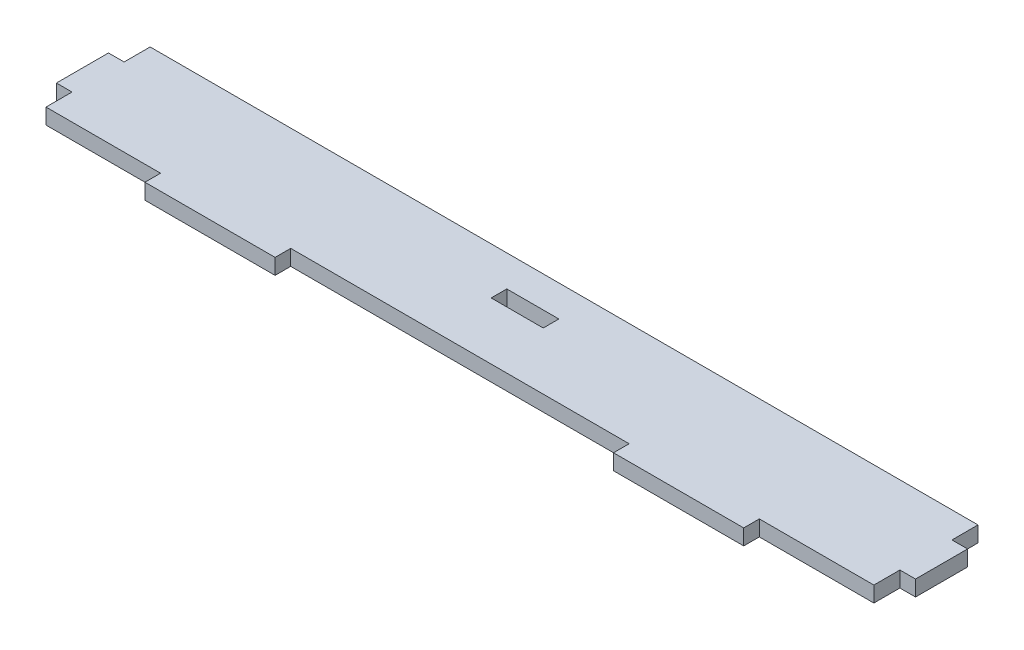
ISO-10303-21;
HEADER;
FILE_DESCRIPTION(('STEP AP214'),'2;1');
FILE_NAME('part.step','',(''),(''),'','','');
FILE_SCHEMA(('AUTOMOTIVE_DESIGN { 1 0 10303 214 1 1 1 1 }'));
ENDSEC;
DATA;
#1=APPLICATION_CONTEXT('core data for automotive mechanical design processes');
#2=APPLICATION_PROTOCOL_DEFINITION('international standard','automotive_design',2000,#1);
#3=PRODUCT_CONTEXT('',#1,'mechanical');
#4=PRODUCT('Part','Part','',(#3));
#5=PRODUCT_RELATED_PRODUCT_CATEGORY('part','',(#4));
#6=PRODUCT_DEFINITION_FORMATION('','',#4);
#7=PRODUCT_DEFINITION_CONTEXT('part definition',#1,'design');
#8=PRODUCT_DEFINITION('design','',#6,#7);
#9=PRODUCT_DEFINITION_SHAPE('','',#8);
#10=(LENGTH_UNIT() NAMED_UNIT(*) SI_UNIT(.MILLI.,.METRE.));
#11=(NAMED_UNIT(*) PLANE_ANGLE_UNIT() SI_UNIT($,.RADIAN.));
#12=(NAMED_UNIT(*) SI_UNIT($,.STERADIAN.) SOLID_ANGLE_UNIT());
#13=UNCERTAINTY_MEASURE_WITH_UNIT(LENGTH_MEASURE(1.E-05),#10,'distance_accuracy_value','');
#14=(GEOMETRIC_REPRESENTATION_CONTEXT(3) GLOBAL_UNCERTAINTY_ASSIGNED_CONTEXT((#13)) GLOBAL_UNIT_ASSIGNED_CONTEXT((#10,
#11,#12)) REPRESENTATION_CONTEXT('',''));
#15=CARTESIAN_POINT('',(0.,0.,0.));
#16=DIRECTION('',(0.,0.,1.));
#17=DIRECTION('',(1.,0.,0.));
#18=AXIS2_PLACEMENT_3D('',#15,#16,#17);
#19=CARTESIAN_POINT('',(0.,3.,0.));
#20=DIRECTION('',(0.,-1.,0.));
#21=DIRECTION('',(0.,0.,-1.));
#22=AXIS2_PLACEMENT_3D('',#19,#20,#21);
#23=PLANE('',#22);
#24=DIRECTION('',(-1.,0.,0.));
#25=VECTOR('',#24,1.);
#26=CARTESIAN_POINT('',(79.5,3.,-10.));
#27=LINE('',#26,#25);
#28=CARTESIAN_POINT('',(79.5,3.,-10.));
#29=VERTEX_POINT('',#28);
#30=CARTESIAN_POINT('',(-79.5,3.,-9.99999999999999));
#31=VERTEX_POINT('',#30);
#32=EDGE_CURVE('E230',#29,#31,#27,.T.);
#33=ORIENTED_EDGE('',*,*,#32,.T.);
#34=DIRECTION('',(0.,0.,1.));
#35=VECTOR('',#34,1.);
#36=CARTESIAN_POINT('',(-79.5,3.,-4.99999999999999));
#37=LINE('',#36,#35);
#38=CARTESIAN_POINT('',(-79.5,3.,-4.99999999999999));
#39=VERTEX_POINT('',#38);
#40=EDGE_CURVE('E233',#31,#39,#37,.T.);
#41=ORIENTED_EDGE('',*,*,#40,.T.);
#42=DIRECTION('',(-1.,0.,0.));
#43=VECTOR('',#42,1.);
#44=CARTESIAN_POINT('',(-79.5,3.,-4.99999999999999));
#45=LINE('',#44,#43);
#46=CARTESIAN_POINT('',(-82.5,3.,-4.99999999999999));
#47=VERTEX_POINT('',#46);
#48=EDGE_CURVE('E236',#39,#47,#45,.T.);
#49=ORIENTED_EDGE('',*,*,#48,.T.);
#50=DIRECTION('',(0.,0.,1.));
#51=VECTOR('',#50,1.);
#52=CARTESIAN_POINT('',(-82.5,3.,-4.99999999999999));
#53=LINE('',#52,#51);
#54=CARTESIAN_POINT('',(-82.5,3.,5.00000000000001));
#55=VERTEX_POINT('',#54);
#56=EDGE_CURVE('E238',#47,#55,#53,.T.);
#57=ORIENTED_EDGE('',*,*,#56,.T.);
#58=DIRECTION('',(1.,0.,0.));
#59=VECTOR('',#58,1.);
#60=CARTESIAN_POINT('',(-79.5,3.,5.00000000000001));
#61=LINE('',#60,#59);
#62=CARTESIAN_POINT('',(-79.5,3.,5.00000000000001));
#63=VERTEX_POINT('',#62);
#64=EDGE_CURVE('E240',#55,#63,#61,.T.);
#65=ORIENTED_EDGE('',*,*,#64,.T.);
#66=DIRECTION('',(0.,0.,1.));
#67=VECTOR('',#66,1.);
#68=CARTESIAN_POINT('',(-79.5,3.,10.));
#69=LINE('',#68,#67);
#70=CARTESIAN_POINT('',(-79.5,3.,10.));
#71=VERTEX_POINT('',#70);
#72=EDGE_CURVE('E242',#63,#71,#69,.T.);
#73=ORIENTED_EDGE('',*,*,#72,.T.);
#74=DIRECTION('',(1.,0.,0.));
#75=VECTOR('',#74,1.);
#76=CARTESIAN_POINT('',(-57.5,3.,10.));
#77=LINE('',#76,#75);
#78=CARTESIAN_POINT('',(-57.5,3.,10.));
#79=VERTEX_POINT('',#78);
#80=EDGE_CURVE('E244',#71,#79,#77,.T.);
#81=ORIENTED_EDGE('',*,*,#80,.T.);
#82=DIRECTION('',(0.,0.,1.));
#83=VECTOR('',#82,1.);
#84=CARTESIAN_POINT('',(-57.5,3.,10.));
#85=LINE('',#84,#83);
#86=CARTESIAN_POINT('',(-57.5,3.,13.));
#87=VERTEX_POINT('',#86);
#88=EDGE_CURVE('E246',#79,#87,#85,.T.);
#89=ORIENTED_EDGE('',*,*,#88,.T.);
#90=DIRECTION('',(1.,0.,0.));
#91=VECTOR('',#90,1.);
#92=CARTESIAN_POINT('',(-57.5,3.,13.));
#93=LINE('',#92,#91);
#94=CARTESIAN_POINT('',(-32.5,3.,13.));
#95=VERTEX_POINT('',#94);
#96=EDGE_CURVE('E248',#87,#95,#93,.T.);
#97=ORIENTED_EDGE('',*,*,#96,.T.);
#98=DIRECTION('',(0.,0.,-1.));
#99=VECTOR('',#98,1.);
#100=CARTESIAN_POINT('',(-32.5,3.,10.));
#101=LINE('',#100,#99);
#102=CARTESIAN_POINT('',(-32.5,3.,10.));
#103=VERTEX_POINT('',#102);
#104=EDGE_CURVE('E250',#95,#103,#101,.T.);
#105=ORIENTED_EDGE('',*,*,#104,.T.);
#106=DIRECTION('',(1.,0.,0.));
#107=VECTOR('',#106,1.);
#108=CARTESIAN_POINT('',(32.5,3.,10.));
#109=LINE('',#108,#107);
#110=CARTESIAN_POINT('',(32.5,3.,10.));
#111=VERTEX_POINT('',#110);
#112=EDGE_CURVE('E252',#103,#111,#109,.T.);
#113=ORIENTED_EDGE('',*,*,#112,.T.);
#114=DIRECTION('',(0.,0.,1.));
#115=VECTOR('',#114,1.);
#116=CARTESIAN_POINT('',(32.5,3.,10.));
#117=LINE('',#116,#115);
#118=CARTESIAN_POINT('',(32.5,3.,13.));
#119=VERTEX_POINT('',#118);
#120=EDGE_CURVE('E254',#111,#119,#117,.T.);
#121=ORIENTED_EDGE('',*,*,#120,.T.);
#122=DIRECTION('',(1.,0.,0.));
#123=VECTOR('',#122,1.);
#124=CARTESIAN_POINT('',(32.5,3.,13.));
#125=LINE('',#124,#123);
#126=CARTESIAN_POINT('',(57.5,3.,13.));
#127=VERTEX_POINT('',#126);
#128=EDGE_CURVE('E256',#119,#127,#125,.T.);
#129=ORIENTED_EDGE('',*,*,#128,.T.);
#130=DIRECTION('',(0.,0.,-1.));
#131=VECTOR('',#130,1.);
#132=CARTESIAN_POINT('',(57.5,3.,9.99999999999999));
#133=LINE('',#132,#131);
#134=CARTESIAN_POINT('',(57.5,3.,9.99999999999999));
#135=VERTEX_POINT('',#134);
#136=EDGE_CURVE('E258',#127,#135,#133,.T.);
#137=ORIENTED_EDGE('',*,*,#136,.T.);
#138=DIRECTION('',(1.,0.,0.));
#139=VECTOR('',#138,1.);
#140=CARTESIAN_POINT('',(79.5,3.,9.99999999999999));
#141=LINE('',#140,#139);
#142=CARTESIAN_POINT('',(79.5,3.,9.99999999999999));
#143=VERTEX_POINT('',#142);
#144=EDGE_CURVE('E260',#135,#143,#141,.T.);
#145=ORIENTED_EDGE('',*,*,#144,.T.);
#146=DIRECTION('',(0.,0.,-1.));
#147=VECTOR('',#146,1.);
#148=CARTESIAN_POINT('',(79.5,3.,9.99999999999999));
#149=LINE('',#148,#147);
#150=CARTESIAN_POINT('',(79.5,3.,5.00000000000001));
#151=VERTEX_POINT('',#150);
#152=EDGE_CURVE('E262',#143,#151,#149,.T.);
#153=ORIENTED_EDGE('',*,*,#152,.T.);
#154=DIRECTION('',(1.,0.,0.));
#155=VECTOR('',#154,1.);
#156=CARTESIAN_POINT('',(79.5,3.,5.00000000000001));
#157=LINE('',#156,#155);
#158=CARTESIAN_POINT('',(82.5,3.,5.00000000000001));
#159=VERTEX_POINT('',#158);
#160=EDGE_CURVE('E264',#151,#159,#157,.T.);
#161=ORIENTED_EDGE('',*,*,#160,.T.);
#162=DIRECTION('',(0.,0.,-1.));
#163=VECTOR('',#162,1.);
#164=CARTESIAN_POINT('',(82.5,3.,-4.99999999999999));
#165=LINE('',#164,#163);
#166=CARTESIAN_POINT('',(82.5,3.,-4.99999999999999));
#167=VERTEX_POINT('',#166);
#168=EDGE_CURVE('E266',#159,#167,#165,.T.);
#169=ORIENTED_EDGE('',*,*,#168,.T.);
#170=DIRECTION('',(-1.,0.,0.));
#171=VECTOR('',#170,1.);
#172=CARTESIAN_POINT('',(79.5,3.,-4.99999999999999));
#173=LINE('',#172,#171);
#174=CARTESIAN_POINT('',(79.5,3.,-4.99999999999999));
#175=VERTEX_POINT('',#174);
#176=EDGE_CURVE('E268',#167,#175,#173,.T.);
#177=ORIENTED_EDGE('',*,*,#176,.T.);
#178=DIRECTION('',(0.,0.,-1.));
#179=VECTOR('',#178,1.);
#180=CARTESIAN_POINT('',(79.5,3.,-4.99999999999999));
#181=LINE('',#180,#179);
#182=EDGE_CURVE('E270',#175,#29,#181,.T.);
#183=ORIENTED_EDGE('',*,*,#182,.T.);
#184=EDGE_LOOP('',(#33,#41,#49,#57,#65,#73,#81,#89,#97,#105,#113,#121,#129,#137,#145,#153,#161,
#169,#177,#183));
#185=FACE_BOUND('',#184,.T.);
#186=DIRECTION('',(0.,0.,-1.));
#187=VECTOR('',#186,1.);
#188=CARTESIAN_POINT('',(5.,3.,-4.));
#189=LINE('',#188,#187);
#190=CARTESIAN_POINT('',(5.,3.,-0.999999999999999));
#191=VERTEX_POINT('',#190);
#192=CARTESIAN_POINT('',(5.,3.,-4.));
#193=VERTEX_POINT('',#192);
#194=EDGE_CURVE('E194',#191,#193,#189,.T.);
#195=ORIENTED_EDGE('',*,*,#194,.F.);
#196=DIRECTION('',(1.,0.,0.));
#197=VECTOR('',#196,1.);
#198=CARTESIAN_POINT('',(-5.,3.,-0.999999999999999));
#199=LINE('',#198,#197);
#200=CARTESIAN_POINT('',(-5.,3.,-0.999999999999999));
#201=VERTEX_POINT('',#200);
#202=EDGE_CURVE('E216',#201,#191,#199,.T.);
#203=ORIENTED_EDGE('',*,*,#202,.F.);
#204=DIRECTION('',(0.,0.,1.));
#205=VECTOR('',#204,1.);
#206=CARTESIAN_POINT('',(-5.,3.,-4.));
#207=LINE('',#206,#205);
#208=CARTESIAN_POINT('',(-5.,3.,-4.));
#209=VERTEX_POINT('',#208);
#210=EDGE_CURVE('E214',#209,#201,#207,.T.);
#211=ORIENTED_EDGE('',*,*,#210,.F.);
#212=DIRECTION('',(-1.,0.,0.));
#213=VECTOR('',#212,1.);
#214=CARTESIAN_POINT('',(-5.,3.,-4.));
#215=LINE('',#214,#213);
#216=EDGE_CURVE('E202',#193,#209,#215,.T.);
#217=ORIENTED_EDGE('',*,*,#216,.F.);
#218=EDGE_LOOP('',(#195,#203,#211,#217));
#219=FACE_BOUND('',#218,.T.);
#220=ADVANCED_FACE('F33',(#185,#219),#23,.F.);
#221=CARTESIAN_POINT('',(0.,0.,0.));
#222=DIRECTION('',(0.,-1.,0.));
#223=DIRECTION('',(0.,0.,-1.));
#224=AXIS2_PLACEMENT_3D('',#221,#222,#223);
#225=PLANE('',#224);
#226=DIRECTION('',(-1.,0.,0.));
#227=VECTOR('',#226,1.);
#228=CARTESIAN_POINT('',(79.5,0.,-10.));
#229=LINE('',#228,#227);
#230=CARTESIAN_POINT('',(79.5,0.,-10.));
#231=VERTEX_POINT('',#230);
#232=CARTESIAN_POINT('',(-79.5,0.,-9.99999999999999));
#233=VERTEX_POINT('',#232);
#234=EDGE_CURVE('E210',#231,#233,#229,.T.);
#235=ORIENTED_EDGE('',*,*,#234,.F.);
#236=DIRECTION('',(0.,0.,-1.));
#237=VECTOR('',#236,1.);
#238=CARTESIAN_POINT('',(79.5,0.,-4.99999999999999));
#239=LINE('',#238,#237);
#240=CARTESIAN_POINT('',(79.5,0.,-4.99999999999999));
#241=VERTEX_POINT('',#240);
#242=EDGE_CURVE('E234',#241,#231,#239,.T.);
#243=ORIENTED_EDGE('',*,*,#242,.F.);
#244=DIRECTION('',(-1.,0.,0.));
#245=VECTOR('',#244,1.);
#246=CARTESIAN_POINT('',(79.5,0.,-4.99999999999999));
#247=LINE('',#246,#245);
#248=CARTESIAN_POINT('',(82.5,0.,-4.99999999999999));
#249=VERTEX_POINT('',#248);
#250=EDGE_CURVE('E309',#249,#241,#247,.T.);
#251=ORIENTED_EDGE('',*,*,#250,.F.);
#252=DIRECTION('',(0.,0.,-1.));
#253=VECTOR('',#252,1.);
#254=CARTESIAN_POINT('',(82.5,0.,-4.99999999999999));
#255=LINE('',#254,#253);
#256=CARTESIAN_POINT('',(82.5,0.,5.00000000000001));
#257=VERTEX_POINT('',#256);
#258=EDGE_CURVE('E307',#257,#249,#255,.T.);
#259=ORIENTED_EDGE('',*,*,#258,.F.);
#260=DIRECTION('',(1.,0.,0.));
#261=VECTOR('',#260,1.);
#262=CARTESIAN_POINT('',(79.5,0.,5.00000000000001));
#263=LINE('',#262,#261);
#264=CARTESIAN_POINT('',(79.5,0.,5.00000000000001));
#265=VERTEX_POINT('',#264);
#266=EDGE_CURVE('E305',#265,#257,#263,.T.);
#267=ORIENTED_EDGE('',*,*,#266,.F.);
#268=DIRECTION('',(0.,0.,-1.));
#269=VECTOR('',#268,1.);
#270=CARTESIAN_POINT('',(79.5,0.,9.99999999999999));
#271=LINE('',#270,#269);
#272=CARTESIAN_POINT('',(79.5,0.,9.99999999999999));
#273=VERTEX_POINT('',#272);
#274=EDGE_CURVE('E303',#273,#265,#271,.T.);
#275=ORIENTED_EDGE('',*,*,#274,.F.);
#276=DIRECTION('',(1.,0.,0.));
#277=VECTOR('',#276,1.);
#278=CARTESIAN_POINT('',(79.5,0.,9.99999999999999));
#279=LINE('',#278,#277);
#280=CARTESIAN_POINT('',(57.5,0.,9.99999999999999));
#281=VERTEX_POINT('',#280);
#282=EDGE_CURVE('E301',#281,#273,#279,.T.);
#283=ORIENTED_EDGE('',*,*,#282,.F.);
#284=DIRECTION('',(0.,0.,-1.));
#285=VECTOR('',#284,1.);
#286=CARTESIAN_POINT('',(57.5,0.,9.99999999999999));
#287=LINE('',#286,#285);
#288=CARTESIAN_POINT('',(57.5,0.,13.));
#289=VERTEX_POINT('',#288);
#290=EDGE_CURVE('E299',#289,#281,#287,.T.);
#291=ORIENTED_EDGE('',*,*,#290,.F.);
#292=DIRECTION('',(1.,0.,0.));
#293=VECTOR('',#292,1.);
#294=CARTESIAN_POINT('',(32.5,0.,13.));
#295=LINE('',#294,#293);
#296=CARTESIAN_POINT('',(32.5,0.,13.));
#297=VERTEX_POINT('',#296);
#298=EDGE_CURVE('E297',#297,#289,#295,.T.);
#299=ORIENTED_EDGE('',*,*,#298,.F.);
#300=DIRECTION('',(0.,0.,1.));
#301=VECTOR('',#300,1.);
#302=CARTESIAN_POINT('',(32.5,0.,10.));
#303=LINE('',#302,#301);
#304=CARTESIAN_POINT('',(32.5,0.,10.));
#305=VERTEX_POINT('',#304);
#306=EDGE_CURVE('E295',#305,#297,#303,.T.);
#307=ORIENTED_EDGE('',*,*,#306,.F.);
#308=DIRECTION('',(1.,0.,0.));
#309=VECTOR('',#308,1.);
#310=CARTESIAN_POINT('',(32.5,0.,10.));
#311=LINE('',#310,#309);
#312=CARTESIAN_POINT('',(-32.5,0.,10.));
#313=VERTEX_POINT('',#312);
#314=EDGE_CURVE('E293',#313,#305,#311,.T.);
#315=ORIENTED_EDGE('',*,*,#314,.F.);
#316=DIRECTION('',(0.,0.,-1.));
#317=VECTOR('',#316,1.);
#318=CARTESIAN_POINT('',(-32.5,0.,10.));
#319=LINE('',#318,#317);
#320=CARTESIAN_POINT('',(-32.5,0.,13.));
#321=VERTEX_POINT('',#320);
#322=EDGE_CURVE('E291',#321,#313,#319,.T.);
#323=ORIENTED_EDGE('',*,*,#322,.F.);
#324=DIRECTION('',(1.,0.,0.));
#325=VECTOR('',#324,1.);
#326=CARTESIAN_POINT('',(-57.5,0.,13.));
#327=LINE('',#326,#325);
#328=CARTESIAN_POINT('',(-57.5,0.,13.));
#329=VERTEX_POINT('',#328);
#330=EDGE_CURVE('E289',#329,#321,#327,.T.);
#331=ORIENTED_EDGE('',*,*,#330,.F.);
#332=DIRECTION('',(0.,0.,1.));
#333=VECTOR('',#332,1.);
#334=CARTESIAN_POINT('',(-57.5,0.,10.));
#335=LINE('',#334,#333);
#336=CARTESIAN_POINT('',(-57.5,0.,10.));
#337=VERTEX_POINT('',#336);
#338=EDGE_CURVE('E287',#337,#329,#335,.T.);
#339=ORIENTED_EDGE('',*,*,#338,.F.);
#340=DIRECTION('',(1.,0.,0.));
#341=VECTOR('',#340,1.);
#342=CARTESIAN_POINT('',(-57.5,0.,10.));
#343=LINE('',#342,#341);
#344=CARTESIAN_POINT('',(-79.5,0.,10.));
#345=VERTEX_POINT('',#344);
#346=EDGE_CURVE('E285',#345,#337,#343,.T.);
#347=ORIENTED_EDGE('',*,*,#346,.F.);
#348=DIRECTION('',(0.,0.,1.));
#349=VECTOR('',#348,1.);
#350=CARTESIAN_POINT('',(-79.5,0.,10.));
#351=LINE('',#350,#349);
#352=CARTESIAN_POINT('',(-79.5,0.,5.00000000000001));
#353=VERTEX_POINT('',#352);
#354=EDGE_CURVE('E283',#353,#345,#351,.T.);
#355=ORIENTED_EDGE('',*,*,#354,.F.);
#356=DIRECTION('',(1.,0.,0.));
#357=VECTOR('',#356,1.);
#358=CARTESIAN_POINT('',(-79.5,0.,5.00000000000001));
#359=LINE('',#358,#357);
#360=CARTESIAN_POINT('',(-82.5,0.,5.00000000000001));
#361=VERTEX_POINT('',#360);
#362=EDGE_CURVE('E281',#361,#353,#359,.T.);
#363=ORIENTED_EDGE('',*,*,#362,.F.);
#364=DIRECTION('',(0.,0.,1.));
#365=VECTOR('',#364,1.);
#366=CARTESIAN_POINT('',(-82.5,0.,-4.99999999999999));
#367=LINE('',#366,#365);
#368=CARTESIAN_POINT('',(-82.5,0.,-4.99999999999999));
#369=VERTEX_POINT('',#368);
#370=EDGE_CURVE('E279',#369,#361,#367,.T.);
#371=ORIENTED_EDGE('',*,*,#370,.F.);
#372=DIRECTION('',(-1.,0.,0.));
#373=VECTOR('',#372,1.);
#374=CARTESIAN_POINT('',(-79.5,0.,-4.99999999999999));
#375=LINE('',#374,#373);
#376=CARTESIAN_POINT('',(-79.5,0.,-4.99999999999999));
#377=VERTEX_POINT('',#376);
#378=EDGE_CURVE('E277',#377,#369,#375,.T.);
#379=ORIENTED_EDGE('',*,*,#378,.F.);
#380=DIRECTION('',(0.,0.,1.));
#381=VECTOR('',#380,1.);
#382=CARTESIAN_POINT('',(-79.5,0.,-4.99999999999999));
#383=LINE('',#382,#381);
#384=EDGE_CURVE('E275',#233,#377,#383,.T.);
#385=ORIENTED_EDGE('',*,*,#384,.F.);
#386=EDGE_LOOP('',(#235,#243,#251,#259,#267,#275,#283,#291,#299,#307,#315,#323,#331,#339,#347,
#355,#363,#371,#379,#385));
#387=FACE_BOUND('',#386,.T.);
#388=DIRECTION('',(1.,0.,0.));
#389=VECTOR('',#388,1.);
#390=CARTESIAN_POINT('',(-5.,0.,-0.999999999999999));
#391=LINE('',#390,#389);
#392=CARTESIAN_POINT('',(-5.,0.,-0.999999999999999));
#393=VERTEX_POINT('',#392);
#394=CARTESIAN_POINT('',(5.,0.,-0.999999999999999));
#395=VERTEX_POINT('',#394);
#396=EDGE_CURVE('E203',#393,#395,#391,.T.);
#397=ORIENTED_EDGE('',*,*,#396,.T.);
#398=DIRECTION('',(0.,0.,-1.));
#399=VECTOR('',#398,1.);
#400=CARTESIAN_POINT('',(5.,0.,-4.));
#401=LINE('',#400,#399);
#402=CARTESIAN_POINT('',(5.,0.,-4.));
#403=VERTEX_POINT('',#402);
#404=EDGE_CURVE('E56',#395,#403,#401,.T.);
#405=ORIENTED_EDGE('',*,*,#404,.T.);
#406=DIRECTION('',(-1.,0.,0.));
#407=VECTOR('',#406,1.);
#408=CARTESIAN_POINT('',(-5.,0.,-4.));
#409=LINE('',#408,#407);
#410=CARTESIAN_POINT('',(-5.,0.,-4.));
#411=VERTEX_POINT('',#410);
#412=EDGE_CURVE('E209',#403,#411,#409,.T.);
#413=ORIENTED_EDGE('',*,*,#412,.T.);
#414=DIRECTION('',(0.,0.,1.));
#415=VECTOR('',#414,1.);
#416=CARTESIAN_POINT('',(-5.,0.,-4.));
#417=LINE('',#416,#415);
#418=EDGE_CURVE('E222',#411,#393,#417,.T.);
#419=ORIENTED_EDGE('',*,*,#418,.T.);
#420=EDGE_LOOP('',(#397,#405,#413,#419));
#421=FACE_BOUND('',#420,.T.);
#422=ADVANCED_FACE('F375',(#387,#421),#225,.T.);
#423=CARTESIAN_POINT('',(79.5,3.,-10.));
#424=DIRECTION('',(0.,0.,1.));
#425=DIRECTION('',(1.,0.,0.));
#426=AXIS2_PLACEMENT_3D('',#423,#424,#425);
#427=PLANE('',#426);
#428=ORIENTED_EDGE('',*,*,#234,.T.);
#429=DIRECTION('',(0.,-1.,0.));
#430=VECTOR('',#429,1.);
#431=CARTESIAN_POINT('',(-79.5,3.,-9.99999999999999));
#432=LINE('',#431,#430);
#433=EDGE_CURVE('E11',#31,#233,#432,.T.);
#434=ORIENTED_EDGE('',*,*,#433,.F.);
#435=ORIENTED_EDGE('',*,*,#32,.F.);
#436=DIRECTION('',(0.,-1.,0.));
#437=VECTOR('',#436,1.);
#438=CARTESIAN_POINT('',(79.5,3.,-10.));
#439=LINE('',#438,#437);
#440=EDGE_CURVE('E272',#29,#231,#439,.T.);
#441=ORIENTED_EDGE('',*,*,#440,.T.);
#442=EDGE_LOOP('',(#428,#434,#435,#441));
#443=FACE_BOUND('',#442,.T.);
#444=ADVANCED_FACE('F35',(#443),#427,.F.);
#445=CARTESIAN_POINT('',(-79.5,3.,-4.99999999999999));
#446=DIRECTION('',(1.,0.,0.));
#447=DIRECTION('',(0.,0.,-1.));
#448=AXIS2_PLACEMENT_3D('',#445,#446,#447);
#449=PLANE('',#448);
#450=ORIENTED_EDGE('',*,*,#384,.T.);
#451=DIRECTION('',(0.,-1.,0.));
#452=VECTOR('',#451,1.);
#453=CARTESIAN_POINT('',(-79.5,3.,-4.99999999999999));
#454=LINE('',#453,#452);
#455=EDGE_CURVE('E41',#39,#377,#454,.T.);
#456=ORIENTED_EDGE('',*,*,#455,.F.);
#457=ORIENTED_EDGE('',*,*,#40,.F.);
#458=ORIENTED_EDGE('',*,*,#433,.T.);
#459=EDGE_LOOP('',(#450,#456,#457,#458));
#460=FACE_BOUND('',#459,.T.);
#461=ADVANCED_FACE('F392',(#460),#449,.F.);
#462=CARTESIAN_POINT('',(-79.5,3.,-4.99999999999999));
#463=DIRECTION('',(0.,0.,1.));
#464=DIRECTION('',(1.,0.,0.));
#465=AXIS2_PLACEMENT_3D('',#462,#463,#464);
#466=PLANE('',#465);
#467=ORIENTED_EDGE('',*,*,#378,.T.);
#468=DIRECTION('',(0.,-1.,0.));
#469=VECTOR('',#468,1.);
#470=CARTESIAN_POINT('',(-82.5,3.,-4.99999999999999));
#471=LINE('',#470,#469);
#472=EDGE_CURVE('E362',#47,#369,#471,.T.);
#473=ORIENTED_EDGE('',*,*,#472,.F.);
#474=ORIENTED_EDGE('',*,*,#48,.F.);
#475=ORIENTED_EDGE('',*,*,#455,.T.);
#476=EDGE_LOOP('',(#467,#473,#474,#475));
#477=FACE_BOUND('',#476,.T.);
#478=ADVANCED_FACE('F369',(#477),#466,.F.);
#479=CARTESIAN_POINT('',(-82.5,3.,-4.99999999999999));
#480=DIRECTION('',(1.,0.,0.));
#481=DIRECTION('',(0.,0.,-1.));
#482=AXIS2_PLACEMENT_3D('',#479,#480,#481);
#483=PLANE('',#482);
#484=ORIENTED_EDGE('',*,*,#370,.T.);
#485=DIRECTION('',(0.,-1.,0.));
#486=VECTOR('',#485,1.);
#487=CARTESIAN_POINT('',(-82.5,3.,5.00000000000001));
#488=LINE('',#487,#486);
#489=EDGE_CURVE('E359',#55,#361,#488,.T.);
#490=ORIENTED_EDGE('',*,*,#489,.F.);
#491=ORIENTED_EDGE('',*,*,#56,.F.);
#492=ORIENTED_EDGE('',*,*,#472,.T.);
#493=EDGE_LOOP('',(#484,#490,#491,#492));
#494=FACE_BOUND('',#493,.T.);
#495=ADVANCED_FACE('F381',(#494),#483,.F.);
#496=CARTESIAN_POINT('',(-79.5,3.,5.00000000000001));
#497=DIRECTION('',(0.,0.,-1.));
#498=DIRECTION('',(-1.,0.,0.));
#499=AXIS2_PLACEMENT_3D('',#496,#497,#498);
#500=PLANE('',#499);
#501=ORIENTED_EDGE('',*,*,#362,.T.);
#502=DIRECTION('',(0.,-1.,0.));
#503=VECTOR('',#502,1.);
#504=CARTESIAN_POINT('',(-79.5,3.,5.00000000000001));
#505=LINE('',#504,#503);
#506=EDGE_CURVE('E356',#63,#353,#505,.T.);
#507=ORIENTED_EDGE('',*,*,#506,.F.);
#508=ORIENTED_EDGE('',*,*,#64,.F.);
#509=ORIENTED_EDGE('',*,*,#489,.T.);
#510=EDGE_LOOP('',(#501,#507,#508,#509));
#511=FACE_BOUND('',#510,.T.);
#512=ADVANCED_FACE('F385',(#511),#500,.F.);
#513=CARTESIAN_POINT('',(-79.5,3.,10.));
#514=DIRECTION('',(1.,0.,0.));
#515=DIRECTION('',(0.,0.,-1.));
#516=AXIS2_PLACEMENT_3D('',#513,#514,#515);
#517=PLANE('',#516);
#518=ORIENTED_EDGE('',*,*,#354,.T.);
#519=DIRECTION('',(0.,-1.,0.));
#520=VECTOR('',#519,1.);
#521=CARTESIAN_POINT('',(-79.5,3.,10.));
#522=LINE('',#521,#520);
#523=EDGE_CURVE('E353',#71,#345,#522,.T.);
#524=ORIENTED_EDGE('',*,*,#523,.F.);
#525=ORIENTED_EDGE('',*,*,#72,.F.);
#526=ORIENTED_EDGE('',*,*,#506,.T.);
#527=EDGE_LOOP('',(#518,#524,#525,#526));
#528=FACE_BOUND('',#527,.T.);
#529=ADVANCED_FACE('F465',(#528),#517,.F.);
#530=CARTESIAN_POINT('',(-57.5,3.,10.));
#531=DIRECTION('',(0.,0.,-1.));
#532=DIRECTION('',(-1.,0.,0.));
#533=AXIS2_PLACEMENT_3D('',#530,#531,#532);
#534=PLANE('',#533);
#535=ORIENTED_EDGE('',*,*,#346,.T.);
#536=DIRECTION('',(0.,-1.,0.));
#537=VECTOR('',#536,1.);
#538=CARTESIAN_POINT('',(-57.5,3.,10.));
#539=LINE('',#538,#537);
#540=EDGE_CURVE('E350',#79,#337,#539,.T.);
#541=ORIENTED_EDGE('',*,*,#540,.F.);
#542=ORIENTED_EDGE('',*,*,#80,.F.);
#543=ORIENTED_EDGE('',*,*,#523,.T.);
#544=EDGE_LOOP('',(#535,#541,#542,#543));
#545=FACE_BOUND('',#544,.T.);
#546=ADVANCED_FACE('F463',(#545),#534,.F.);
#547=CARTESIAN_POINT('',(-57.5,3.,10.));
#548=DIRECTION('',(1.,0.,0.));
#549=DIRECTION('',(0.,0.,-1.));
#550=AXIS2_PLACEMENT_3D('',#547,#548,#549);
#551=PLANE('',#550);
#552=ORIENTED_EDGE('',*,*,#338,.T.);
#553=DIRECTION('',(0.,-1.,0.));
#554=VECTOR('',#553,1.);
#555=CARTESIAN_POINT('',(-57.5,3.,13.));
#556=LINE('',#555,#554);
#557=EDGE_CURVE('E347',#87,#329,#556,.T.);
#558=ORIENTED_EDGE('',*,*,#557,.F.);
#559=ORIENTED_EDGE('',*,*,#88,.F.);
#560=ORIENTED_EDGE('',*,*,#540,.T.);
#561=EDGE_LOOP('',(#552,#558,#559,#560));
#562=FACE_BOUND('',#561,.T.);
#563=ADVANCED_FACE('F458',(#562),#551,.F.);
#564=CARTESIAN_POINT('',(-57.5,3.,13.));
#565=DIRECTION('',(0.,0.,-1.));
#566=DIRECTION('',(-1.,0.,0.));
#567=AXIS2_PLACEMENT_3D('',#564,#565,#566);
#568=PLANE('',#567);
#569=ORIENTED_EDGE('',*,*,#330,.T.);
#570=DIRECTION('',(0.,-1.,0.));
#571=VECTOR('',#570,1.);
#572=CARTESIAN_POINT('',(-32.5,3.,13.));
#573=LINE('',#572,#571);
#574=EDGE_CURVE('E344',#95,#321,#573,.T.);
#575=ORIENTED_EDGE('',*,*,#574,.F.);
#576=ORIENTED_EDGE('',*,*,#96,.F.);
#577=ORIENTED_EDGE('',*,*,#557,.T.);
#578=EDGE_LOOP('',(#569,#575,#576,#577));
#579=FACE_BOUND('',#578,.T.);
#580=ADVANCED_FACE('F453',(#579),#568,.F.);
#581=CARTESIAN_POINT('',(-32.5,3.,10.));
#582=DIRECTION('',(-1.,0.,0.));
#583=DIRECTION('',(0.,0.,1.));
#584=AXIS2_PLACEMENT_3D('',#581,#582,#583);
#585=PLANE('',#584);
#586=ORIENTED_EDGE('',*,*,#322,.T.);
#587=DIRECTION('',(0.,-1.,0.));
#588=VECTOR('',#587,1.);
#589=CARTESIAN_POINT('',(-32.5,3.,10.));
#590=LINE('',#589,#588);
#591=EDGE_CURVE('E341',#103,#313,#590,.T.);
#592=ORIENTED_EDGE('',*,*,#591,.F.);
#593=ORIENTED_EDGE('',*,*,#104,.F.);
#594=ORIENTED_EDGE('',*,*,#574,.T.);
#595=EDGE_LOOP('',(#586,#592,#593,#594));
#596=FACE_BOUND('',#595,.T.);
#597=ADVANCED_FACE('F449',(#596),#585,.F.);
#598=CARTESIAN_POINT('',(32.5,3.,10.));
#599=DIRECTION('',(0.,0.,-1.));
#600=DIRECTION('',(-1.,0.,0.));
#601=AXIS2_PLACEMENT_3D('',#598,#599,#600);
#602=PLANE('',#601);
#603=ORIENTED_EDGE('',*,*,#314,.T.);
#604=DIRECTION('',(0.,-1.,0.));
#605=VECTOR('',#604,1.);
#606=CARTESIAN_POINT('',(32.5,3.,10.));
#607=LINE('',#606,#605);
#608=EDGE_CURVE('E338',#111,#305,#607,.T.);
#609=ORIENTED_EDGE('',*,*,#608,.F.);
#610=ORIENTED_EDGE('',*,*,#112,.F.);
#611=ORIENTED_EDGE('',*,*,#591,.T.);
#612=EDGE_LOOP('',(#603,#609,#610,#611));
#613=FACE_BOUND('',#612,.T.);
#614=ADVANCED_FACE('F444',(#613),#602,.F.);
#615=CARTESIAN_POINT('',(32.5,3.,10.));
#616=DIRECTION('',(1.,0.,0.));
#617=DIRECTION('',(0.,0.,-1.));
#618=AXIS2_PLACEMENT_3D('',#615,#616,#617);
#619=PLANE('',#618);
#620=ORIENTED_EDGE('',*,*,#306,.T.);
#621=DIRECTION('',(0.,-1.,0.));
#622=VECTOR('',#621,1.);
#623=CARTESIAN_POINT('',(32.5,3.,13.));
#624=LINE('',#623,#622);
#625=EDGE_CURVE('E335',#119,#297,#624,.T.);
#626=ORIENTED_EDGE('',*,*,#625,.F.);
#627=ORIENTED_EDGE('',*,*,#120,.F.);
#628=ORIENTED_EDGE('',*,*,#608,.T.);
#629=EDGE_LOOP('',(#620,#626,#627,#628));
#630=FACE_BOUND('',#629,.T.);
#631=ADVANCED_FACE('F438',(#630),#619,.F.);
#632=CARTESIAN_POINT('',(32.5,3.,13.));
#633=DIRECTION('',(0.,0.,-1.));
#634=DIRECTION('',(-1.,0.,0.));
#635=AXIS2_PLACEMENT_3D('',#632,#633,#634);
#636=PLANE('',#635);
#637=ORIENTED_EDGE('',*,*,#298,.T.);
#638=DIRECTION('',(0.,-1.,0.));
#639=VECTOR('',#638,1.);
#640=CARTESIAN_POINT('',(57.5,3.,13.));
#641=LINE('',#640,#639);
#642=EDGE_CURVE('E332',#127,#289,#641,.T.);
#643=ORIENTED_EDGE('',*,*,#642,.F.);
#644=ORIENTED_EDGE('',*,*,#128,.F.);
#645=ORIENTED_EDGE('',*,*,#625,.T.);
#646=EDGE_LOOP('',(#637,#643,#644,#645));
#647=FACE_BOUND('',#646,.T.);
#648=ADVANCED_FACE('F434',(#647),#636,.F.);
#649=CARTESIAN_POINT('',(57.5,3.,9.99999999999999));
#650=DIRECTION('',(-1.,0.,0.));
#651=DIRECTION('',(0.,0.,1.));
#652=AXIS2_PLACEMENT_3D('',#649,#650,#651);
#653=PLANE('',#652);
#654=ORIENTED_EDGE('',*,*,#290,.T.);
#655=DIRECTION('',(0.,-1.,0.));
#656=VECTOR('',#655,1.);
#657=CARTESIAN_POINT('',(57.5,3.,9.99999999999999));
#658=LINE('',#657,#656);
#659=EDGE_CURVE('E329',#135,#281,#658,.T.);
#660=ORIENTED_EDGE('',*,*,#659,.F.);
#661=ORIENTED_EDGE('',*,*,#136,.F.);
#662=ORIENTED_EDGE('',*,*,#642,.T.);
#663=EDGE_LOOP('',(#654,#660,#661,#662));
#664=FACE_BOUND('',#663,.T.);
#665=ADVANCED_FACE('F429',(#664),#653,.F.);
#666=CARTESIAN_POINT('',(79.5,3.,9.99999999999999));
#667=DIRECTION('',(0.,0.,-1.));
#668=DIRECTION('',(-1.,0.,0.));
#669=AXIS2_PLACEMENT_3D('',#666,#667,#668);
#670=PLANE('',#669);
#671=ORIENTED_EDGE('',*,*,#282,.T.);
#672=DIRECTION('',(0.,-1.,0.));
#673=VECTOR('',#672,1.);
#674=CARTESIAN_POINT('',(79.5,3.,9.99999999999999));
#675=LINE('',#674,#673);
#676=EDGE_CURVE('E326',#143,#273,#675,.T.);
#677=ORIENTED_EDGE('',*,*,#676,.F.);
#678=ORIENTED_EDGE('',*,*,#144,.F.);
#679=ORIENTED_EDGE('',*,*,#659,.T.);
#680=EDGE_LOOP('',(#671,#677,#678,#679));
#681=FACE_BOUND('',#680,.T.);
#682=ADVANCED_FACE('F423',(#681),#670,.F.);
#683=CARTESIAN_POINT('',(79.5,3.,9.99999999999999));
#684=DIRECTION('',(-1.,0.,0.));
#685=DIRECTION('',(0.,0.,1.));
#686=AXIS2_PLACEMENT_3D('',#683,#684,#685);
#687=PLANE('',#686);
#688=ORIENTED_EDGE('',*,*,#274,.T.);
#689=DIRECTION('',(0.,-1.,0.));
#690=VECTOR('',#689,1.);
#691=CARTESIAN_POINT('',(79.5,3.,5.00000000000001));
#692=LINE('',#691,#690);
#693=EDGE_CURVE('E323',#151,#265,#692,.T.);
#694=ORIENTED_EDGE('',*,*,#693,.F.);
#695=ORIENTED_EDGE('',*,*,#152,.F.);
#696=ORIENTED_EDGE('',*,*,#676,.T.);
#697=EDGE_LOOP('',(#688,#694,#695,#696));
#698=FACE_BOUND('',#697,.T.);
#699=ADVANCED_FACE('F419',(#698),#687,.F.);
#700=CARTESIAN_POINT('',(79.5,3.,5.00000000000001));
#701=DIRECTION('',(0.,0.,-1.));
#702=DIRECTION('',(-1.,0.,0.));
#703=AXIS2_PLACEMENT_3D('',#700,#701,#702);
#704=PLANE('',#703);
#705=ORIENTED_EDGE('',*,*,#266,.T.);
#706=DIRECTION('',(0.,-1.,0.));
#707=VECTOR('',#706,1.);
#708=CARTESIAN_POINT('',(82.5,3.,5.00000000000001));
#709=LINE('',#708,#707);
#710=EDGE_CURVE('E320',#159,#257,#709,.T.);
#711=ORIENTED_EDGE('',*,*,#710,.F.);
#712=ORIENTED_EDGE('',*,*,#160,.F.);
#713=ORIENTED_EDGE('',*,*,#693,.T.);
#714=EDGE_LOOP('',(#705,#711,#712,#713));
#715=FACE_BOUND('',#714,.T.);
#716=ADVANCED_FACE('F414',(#715),#704,.F.);
#717=CARTESIAN_POINT('',(82.5,3.,-4.99999999999999));
#718=DIRECTION('',(-1.,0.,0.));
#719=DIRECTION('',(0.,0.,1.));
#720=AXIS2_PLACEMENT_3D('',#717,#718,#719);
#721=PLANE('',#720);
#722=ORIENTED_EDGE('',*,*,#258,.T.);
#723=DIRECTION('',(0.,-1.,0.));
#724=VECTOR('',#723,1.);
#725=CARTESIAN_POINT('',(82.5,3.,-4.99999999999999));
#726=LINE('',#725,#724);
#727=EDGE_CURVE('E317',#167,#249,#726,.T.);
#728=ORIENTED_EDGE('',*,*,#727,.F.);
#729=ORIENTED_EDGE('',*,*,#168,.F.);
#730=ORIENTED_EDGE('',*,*,#710,.T.);
#731=EDGE_LOOP('',(#722,#728,#729,#730));
#732=FACE_BOUND('',#731,.T.);
#733=ADVANCED_FACE('F408',(#732),#721,.F.);
#734=CARTESIAN_POINT('',(79.5,3.,-4.99999999999999));
#735=DIRECTION('',(0.,0.,1.));
#736=DIRECTION('',(1.,0.,0.));
#737=AXIS2_PLACEMENT_3D('',#734,#735,#736);
#738=PLANE('',#737);
#739=ORIENTED_EDGE('',*,*,#250,.T.);
#740=DIRECTION('',(0.,-1.,0.));
#741=VECTOR('',#740,1.);
#742=CARTESIAN_POINT('',(79.5,3.,-4.99999999999999));
#743=LINE('',#742,#741);
#744=EDGE_CURVE('E314',#175,#241,#743,.T.);
#745=ORIENTED_EDGE('',*,*,#744,.F.);
#746=ORIENTED_EDGE('',*,*,#176,.F.);
#747=ORIENTED_EDGE('',*,*,#727,.T.);
#748=EDGE_LOOP('',(#739,#745,#746,#747));
#749=FACE_BOUND('',#748,.T.);
#750=ADVANCED_FACE('F404',(#749),#738,.F.);
#751=CARTESIAN_POINT('',(79.5,3.,-4.99999999999999));
#752=DIRECTION('',(-1.,0.,0.));
#753=DIRECTION('',(0.,0.,1.));
#754=AXIS2_PLACEMENT_3D('',#751,#752,#753);
#755=PLANE('',#754);
#756=ORIENTED_EDGE('',*,*,#242,.T.);
#757=ORIENTED_EDGE('',*,*,#440,.F.);
#758=ORIENTED_EDGE('',*,*,#182,.F.);
#759=ORIENTED_EDGE('',*,*,#744,.T.);
#760=EDGE_LOOP('',(#756,#757,#758,#759));
#761=FACE_BOUND('',#760,.T.);
#762=ADVANCED_FACE('F399',(#761),#755,.F.);
#763=CARTESIAN_POINT('',(5.,3.,-4.));
#764=DIRECTION('',(-1.,0.,0.));
#765=DIRECTION('',(0.,0.,1.));
#766=AXIS2_PLACEMENT_3D('',#763,#764,#765);
#767=PLANE('',#766);
#768=ORIENTED_EDGE('',*,*,#404,.F.);
#769=DIRECTION('',(0.,-1.,0.));
#770=VECTOR('',#769,1.);
#771=CARTESIAN_POINT('',(5.,3.,-0.999999999999999));
#772=LINE('',#771,#770);
#773=EDGE_CURVE('E198',#191,#395,#772,.T.);
#774=ORIENTED_EDGE('',*,*,#773,.F.);
#775=ORIENTED_EDGE('',*,*,#194,.T.);
#776=DIRECTION('',(0.,-1.,0.));
#777=VECTOR('',#776,1.);
#778=CARTESIAN_POINT('',(5.,3.,-4.));
#779=LINE('',#778,#777);
#780=EDGE_CURVE('E197',#193,#403,#779,.T.);
#781=ORIENTED_EDGE('',*,*,#780,.T.);
#782=EDGE_LOOP('',(#768,#774,#775,#781));
#783=FACE_BOUND('',#782,.T.);
#784=ADVANCED_FACE('F196',(#783),#767,.T.);
#785=CARTESIAN_POINT('',(-5.,3.,-4.));
#786=DIRECTION('',(0.,0.,1.));
#787=DIRECTION('',(1.,0.,0.));
#788=AXIS2_PLACEMENT_3D('',#785,#786,#787);
#789=PLANE('',#788);
#790=ORIENTED_EDGE('',*,*,#412,.F.);
#791=ORIENTED_EDGE('',*,*,#780,.F.);
#792=ORIENTED_EDGE('',*,*,#216,.T.);
#793=DIRECTION('',(0.,-1.,0.));
#794=VECTOR('',#793,1.);
#795=CARTESIAN_POINT('',(-5.,3.,-4.));
#796=LINE('',#795,#794);
#797=EDGE_CURVE('E211',#209,#411,#796,.T.);
#798=ORIENTED_EDGE('',*,*,#797,.T.);
#799=EDGE_LOOP('',(#790,#791,#792,#798));
#800=FACE_BOUND('',#799,.T.);
#801=ADVANCED_FACE('F206',(#800),#789,.T.);
#802=CARTESIAN_POINT('',(-5.,3.,-4.));
#803=DIRECTION('',(1.,0.,0.));
#804=DIRECTION('',(0.,0.,-1.));
#805=AXIS2_PLACEMENT_3D('',#802,#803,#804);
#806=PLANE('',#805);
#807=ORIENTED_EDGE('',*,*,#418,.F.);
#808=ORIENTED_EDGE('',*,*,#797,.F.);
#809=ORIENTED_EDGE('',*,*,#210,.T.);
#810=DIRECTION('',(0.,-1.,0.));
#811=VECTOR('',#810,1.);
#812=CARTESIAN_POINT('',(-5.,3.,-0.999999999999999));
#813=LINE('',#812,#811);
#814=EDGE_CURVE('E48',#201,#393,#813,.T.);
#815=ORIENTED_EDGE('',*,*,#814,.T.);
#816=EDGE_LOOP('',(#807,#808,#809,#815));
#817=FACE_BOUND('',#816,.T.);
#818=ADVANCED_FACE('F571',(#817),#806,.T.);
#819=CARTESIAN_POINT('',(-5.,3.,-0.999999999999999));
#820=DIRECTION('',(0.,0.,-1.));
#821=DIRECTION('',(-1.,0.,0.));
#822=AXIS2_PLACEMENT_3D('',#819,#820,#821);
#823=PLANE('',#822);
#824=ORIENTED_EDGE('',*,*,#396,.F.);
#825=ORIENTED_EDGE('',*,*,#814,.F.);
#826=ORIENTED_EDGE('',*,*,#202,.T.);
#827=ORIENTED_EDGE('',*,*,#773,.T.);
#828=EDGE_LOOP('',(#824,#825,#826,#827));
#829=FACE_BOUND('',#828,.T.);
#830=ADVANCED_FACE('F577',(#829),#823,.T.);
#831=CLOSED_SHELL('',(#220,#422,#444,#461,#478,#495,#512,#529,#546,#563,#580,#597,#614,#631,
#648,#665,#682,#699,#716,#733,#750,#762,#784,#801,#818,#830));
#832=MANIFOLD_SOLID_BREP('B2',#831);
#833=ADVANCED_BREP_SHAPE_REPRESENTATION('',(#18,#832),#14);
#834=SHAPE_DEFINITION_REPRESENTATION(#9,#833);
ENDSEC;
END-ISO-10303-21;
